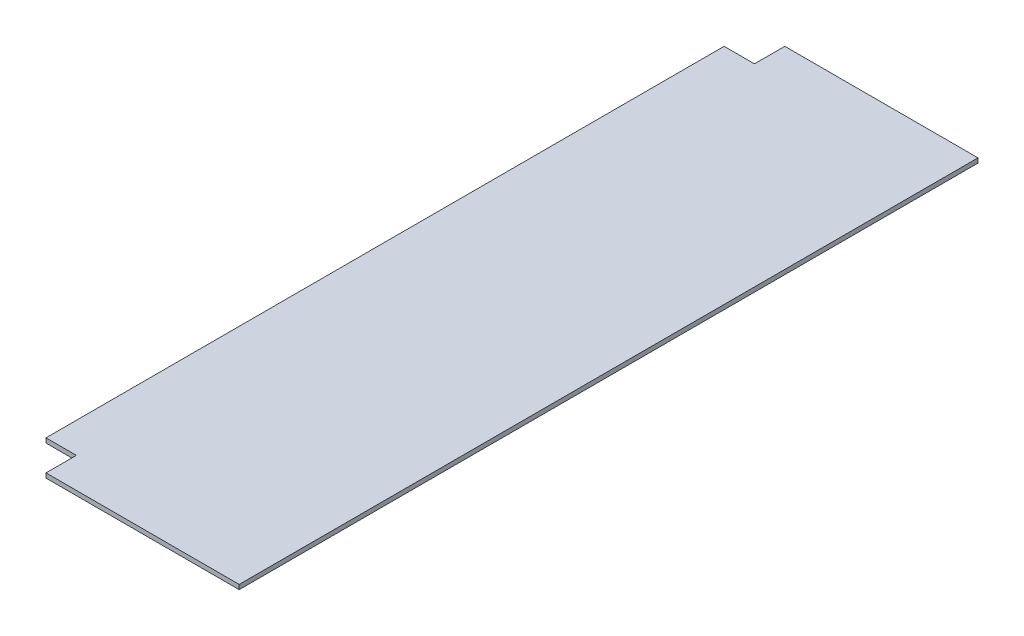
ISO-10303-21;
HEADER;
FILE_DESCRIPTION(('STEP AP214'),'2;1');
FILE_NAME('part.step','',(''),(''),'','','');
FILE_SCHEMA(('AUTOMOTIVE_DESIGN { 1 0 10303 214 1 1 1 1 }'));
ENDSEC;
DATA;
#1=APPLICATION_CONTEXT('core data for automotive mechanical design processes');
#2=APPLICATION_PROTOCOL_DEFINITION('international standard','automotive_design',2000,#1);
#3=PRODUCT_CONTEXT('',#1,'mechanical');
#4=PRODUCT('Part','Part','',(#3));
#5=PRODUCT_RELATED_PRODUCT_CATEGORY('part','',(#4));
#6=PRODUCT_DEFINITION_FORMATION('','',#4);
#7=PRODUCT_DEFINITION_CONTEXT('part definition',#1,'design');
#8=PRODUCT_DEFINITION('design','',#6,#7);
#9=PRODUCT_DEFINITION_SHAPE('','',#8);
#10=(LENGTH_UNIT() NAMED_UNIT(*) SI_UNIT(.MILLI.,.METRE.));
#11=(NAMED_UNIT(*) PLANE_ANGLE_UNIT() SI_UNIT($,.RADIAN.));
#12=(NAMED_UNIT(*) SI_UNIT($,.STERADIAN.) SOLID_ANGLE_UNIT());
#13=UNCERTAINTY_MEASURE_WITH_UNIT(LENGTH_MEASURE(1.E-05),#10,'distance_accuracy_value','');
#14=(GEOMETRIC_REPRESENTATION_CONTEXT(3) GLOBAL_UNCERTAINTY_ASSIGNED_CONTEXT((#13)) GLOBAL_UNIT_ASSIGNED_CONTEXT((#10,
#11,#12)) REPRESENTATION_CONTEXT('',''));
#15=CARTESIAN_POINT('',(0.,0.,0.));
#16=DIRECTION('',(0.,0.,1.));
#17=DIRECTION('',(1.,0.,0.));
#18=AXIS2_PLACEMENT_3D('',#15,#16,#17);
#19=CARTESIAN_POINT('',(123.917455195695,4.5,-365.));
#20=DIRECTION('',(-1.,0.,0.));
#21=DIRECTION('',(0.,0.,1.));
#22=AXIS2_PLACEMENT_3D('',#19,#20,#21);
#23=PLANE('',#22);
#24=DIRECTION('',(0.,0.,-1.));
#25=VECTOR('',#24,1.);
#26=CARTESIAN_POINT('',(123.917455195695,0.,-365.));
#27=LINE('',#26,#25);
#28=CARTESIAN_POINT('',(123.917455195696,0.,365.));
#29=VERTEX_POINT('',#28);
#30=CARTESIAN_POINT('',(123.917455195695,0.,-365.));
#31=VERTEX_POINT('',#30);
#32=EDGE_CURVE('E140',#29,#31,#27,.T.);
#33=ORIENTED_EDGE('',*,*,#32,.T.);
#34=DIRECTION('',(0.,-1.,0.));
#35=VECTOR('',#34,1.);
#36=CARTESIAN_POINT('',(123.917455195695,4.5,-365.));
#37=LINE('',#36,#35);
#38=CARTESIAN_POINT('',(123.917455195695,4.5,-365.));
#39=VERTEX_POINT('',#38);
#40=EDGE_CURVE('E11',#39,#31,#37,.T.);
#41=ORIENTED_EDGE('',*,*,#40,.F.);
#42=DIRECTION('',(0.,0.,-1.));
#43=VECTOR('',#42,1.);
#44=CARTESIAN_POINT('',(123.917455195695,4.5,-365.));
#45=LINE('',#44,#43);
#46=CARTESIAN_POINT('',(123.917455195696,4.5,365.));
#47=VERTEX_POINT('',#46);
#48=EDGE_CURVE('E162',#47,#39,#45,.T.);
#49=ORIENTED_EDGE('',*,*,#48,.F.);
#50=DIRECTION('',(0.,-1.,0.));
#51=VECTOR('',#50,1.);
#52=CARTESIAN_POINT('',(123.917455195696,4.5,365.));
#53=LINE('',#52,#51);
#54=EDGE_CURVE('E136',#47,#29,#53,.T.);
#55=ORIENTED_EDGE('',*,*,#54,.T.);
#56=EDGE_LOOP('',(#33,#41,#49,#55));
#57=FACE_BOUND('',#56,.T.);
#58=ADVANCED_FACE('F39',(#57),#23,.F.);
#59=CARTESIAN_POINT('',(-66.9625448043045,4.5,-365.));
#60=DIRECTION('',(0.,0.,1.));
#61=DIRECTION('',(1.,0.,0.));
#62=AXIS2_PLACEMENT_3D('',#59,#60,#61);
#63=PLANE('',#62);
#64=DIRECTION('',(-1.,0.,0.));
#65=VECTOR('',#64,1.);
#66=CARTESIAN_POINT('',(-66.9625448043045,0.,-365.));
#67=LINE('',#66,#65);
#68=CARTESIAN_POINT('',(-66.9625448043045,0.,-365.));
#69=VERTEX_POINT('',#68);
#70=EDGE_CURVE('E144',#31,#69,#67,.T.);
#71=ORIENTED_EDGE('',*,*,#70,.T.);
#72=DIRECTION('',(0.,-1.,0.));
#73=VECTOR('',#72,1.);
#74=CARTESIAN_POINT('',(-66.9625448043045,4.5,-365.));
#75=LINE('',#74,#73);
#76=CARTESIAN_POINT('',(-66.9625448043045,4.5,-365.));
#77=VERTEX_POINT('',#76);
#78=EDGE_CURVE('E48',#77,#69,#75,.T.);
#79=ORIENTED_EDGE('',*,*,#78,.F.);
#80=DIRECTION('',(-1.,0.,0.));
#81=VECTOR('',#80,1.);
#82=CARTESIAN_POINT('',(-66.9625448043045,4.5,-365.));
#83=LINE('',#82,#81);
#84=EDGE_CURVE('E99',#39,#77,#83,.T.);
#85=ORIENTED_EDGE('',*,*,#84,.F.);
#86=ORIENTED_EDGE('',*,*,#40,.T.);
#87=EDGE_LOOP('',(#71,#79,#85,#86));
#88=FACE_BOUND('',#87,.T.);
#89=ADVANCED_FACE('F208',(#88),#63,.F.);
#90=CARTESIAN_POINT('',(-66.9625448043045,4.5,-365.));
#91=DIRECTION('',(1.,0.,0.));
#92=DIRECTION('',(0.,0.,-1.));
#93=AXIS2_PLACEMENT_3D('',#90,#91,#92);
#94=PLANE('',#93);
#95=DIRECTION('',(0.,0.,1.));
#96=VECTOR('',#95,1.);
#97=CARTESIAN_POINT('',(-66.9625448043045,0.,-365.));
#98=LINE('',#97,#96);
#99=CARTESIAN_POINT('',(-66.9625448043045,0.,-335.));
#100=VERTEX_POINT('',#99);
#101=EDGE_CURVE('E147',#69,#100,#98,.T.);
#102=ORIENTED_EDGE('',*,*,#101,.T.);
#103=DIRECTION('',(0.,-1.,0.));
#104=VECTOR('',#103,1.);
#105=CARTESIAN_POINT('',(-66.9625448043045,4.5,-335.));
#106=LINE('',#105,#104);
#107=CARTESIAN_POINT('',(-66.9625448043045,4.5,-335.));
#108=VERTEX_POINT('',#107);
#109=EDGE_CURVE('E173',#108,#100,#106,.T.);
#110=ORIENTED_EDGE('',*,*,#109,.F.);
#111=DIRECTION('',(0.,0.,1.));
#112=VECTOR('',#111,1.);
#113=CARTESIAN_POINT('',(-66.9625448043045,4.5,-365.));
#114=LINE('',#113,#112);
#115=EDGE_CURVE('E183',#77,#108,#114,.T.);
#116=ORIENTED_EDGE('',*,*,#115,.F.);
#117=ORIENTED_EDGE('',*,*,#78,.T.);
#118=EDGE_LOOP('',(#102,#110,#116,#117));
#119=FACE_BOUND('',#118,.T.);
#120=ADVANCED_FACE('F181',(#119),#94,.F.);
#121=CARTESIAN_POINT('',(-96.9625448043045,4.5,-335.));
#122=DIRECTION('',(0.,0.,1.));
#123=DIRECTION('',(1.,0.,0.));
#124=AXIS2_PLACEMENT_3D('',#121,#122,#123);
#125=PLANE('',#124);
#126=DIRECTION('',(-1.,0.,0.));
#127=VECTOR('',#126,1.);
#128=CARTESIAN_POINT('',(-96.9625448043045,0.,-335.));
#129=LINE('',#128,#127);
#130=CARTESIAN_POINT('',(-96.9625448043045,0.,-335.));
#131=VERTEX_POINT('',#130);
#132=EDGE_CURVE('E150',#100,#131,#129,.T.);
#133=ORIENTED_EDGE('',*,*,#132,.T.);
#134=DIRECTION('',(0.,-1.,0.));
#135=VECTOR('',#134,1.);
#136=CARTESIAN_POINT('',(-96.9625448043045,4.5,-335.));
#137=LINE('',#136,#135);
#138=CARTESIAN_POINT('',(-96.9625448043045,4.5,-335.));
#139=VERTEX_POINT('',#138);
#140=EDGE_CURVE('E169',#139,#131,#137,.T.);
#141=ORIENTED_EDGE('',*,*,#140,.F.);
#142=DIRECTION('',(-1.,0.,0.));
#143=VECTOR('',#142,1.);
#144=CARTESIAN_POINT('',(-96.9625448043045,4.5,-335.));
#145=LINE('',#144,#143);
#146=EDGE_CURVE('E196',#108,#139,#145,.T.);
#147=ORIENTED_EDGE('',*,*,#146,.F.);
#148=ORIENTED_EDGE('',*,*,#109,.T.);
#149=EDGE_LOOP('',(#133,#141,#147,#148));
#150=FACE_BOUND('',#149,.T.);
#151=ADVANCED_FACE('F191',(#150),#125,.F.);
#152=CARTESIAN_POINT('',(-96.9625448043045,4.5,-335.));
#153=DIRECTION('',(1.,0.,0.));
#154=DIRECTION('',(0.,0.,-1.));
#155=AXIS2_PLACEMENT_3D('',#152,#153,#154);
#156=PLANE('',#155);
#157=DIRECTION('',(0.,0.,1.));
#158=VECTOR('',#157,1.);
#159=CARTESIAN_POINT('',(-96.9625448043045,0.,-335.));
#160=LINE('',#159,#158);
#161=CARTESIAN_POINT('',(-96.9625448043044,0.,335.));
#162=VERTEX_POINT('',#161);
#163=EDGE_CURVE('E153',#131,#162,#160,.T.);
#164=ORIENTED_EDGE('',*,*,#163,.T.);
#165=DIRECTION('',(0.,-1.,0.));
#166=VECTOR('',#165,1.);
#167=CARTESIAN_POINT('',(-96.9625448043044,4.5,335.));
#168=LINE('',#167,#166);
#169=CARTESIAN_POINT('',(-96.9625448043044,4.5,335.));
#170=VERTEX_POINT('',#169);
#171=EDGE_CURVE('E129',#170,#162,#168,.T.);
#172=ORIENTED_EDGE('',*,*,#171,.F.);
#173=DIRECTION('',(0.,0.,1.));
#174=VECTOR('',#173,1.);
#175=CARTESIAN_POINT('',(-96.9625448043045,4.5,-335.));
#176=LINE('',#175,#174);
#177=EDGE_CURVE('E118',#139,#170,#176,.T.);
#178=ORIENTED_EDGE('',*,*,#177,.F.);
#179=ORIENTED_EDGE('',*,*,#140,.T.);
#180=EDGE_LOOP('',(#164,#172,#178,#179));
#181=FACE_BOUND('',#180,.T.);
#182=ADVANCED_FACE('F194',(#181),#156,.F.);
#183=CARTESIAN_POINT('',(-96.9625448043044,4.5,335.));
#184=DIRECTION('',(0.,0.,-1.));
#185=DIRECTION('',(-1.,0.,0.));
#186=AXIS2_PLACEMENT_3D('',#183,#184,#185);
#187=PLANE('',#186);
#188=DIRECTION('',(1.,0.,0.));
#189=VECTOR('',#188,1.);
#190=CARTESIAN_POINT('',(-96.9625448043044,0.,335.));
#191=LINE('',#190,#189);
#192=CARTESIAN_POINT('',(-66.9625448043045,0.,335.));
#193=VERTEX_POINT('',#192);
#194=EDGE_CURVE('E127',#162,#193,#191,.T.);
#195=ORIENTED_EDGE('',*,*,#194,.T.);
#196=DIRECTION('',(0.,-1.,0.));
#197=VECTOR('',#196,1.);
#198=CARTESIAN_POINT('',(-66.9625448043045,4.5,335.));
#199=LINE('',#198,#197);
#200=CARTESIAN_POINT('',(-66.9625448043045,4.5,335.));
#201=VERTEX_POINT('',#200);
#202=EDGE_CURVE('E124',#201,#193,#199,.T.);
#203=ORIENTED_EDGE('',*,*,#202,.F.);
#204=DIRECTION('',(1.,0.,0.));
#205=VECTOR('',#204,1.);
#206=CARTESIAN_POINT('',(-96.9625448043044,4.5,335.));
#207=LINE('',#206,#205);
#208=EDGE_CURVE('E112',#170,#201,#207,.T.);
#209=ORIENTED_EDGE('',*,*,#208,.F.);
#210=ORIENTED_EDGE('',*,*,#171,.T.);
#211=EDGE_LOOP('',(#195,#203,#209,#210));
#212=FACE_BOUND('',#211,.T.);
#213=ADVANCED_FACE('F125',(#212),#187,.F.);
#214=CARTESIAN_POINT('',(-66.9625448043045,4.5,365.));
#215=DIRECTION('',(1.,0.,0.));
#216=DIRECTION('',(0.,0.,-1.));
#217=AXIS2_PLACEMENT_3D('',#214,#215,#216);
#218=PLANE('',#217);
#219=DIRECTION('',(0.,0.,1.));
#220=VECTOR('',#219,1.);
#221=CARTESIAN_POINT('',(-66.9625448043045,0.,365.));
#222=LINE('',#221,#220);
#223=CARTESIAN_POINT('',(-66.9625448043045,0.,365.));
#224=VERTEX_POINT('',#223);
#225=EDGE_CURVE('E85',#193,#224,#222,.T.);
#226=ORIENTED_EDGE('',*,*,#225,.T.);
#227=DIRECTION('',(0.,-1.,0.));
#228=VECTOR('',#227,1.);
#229=CARTESIAN_POINT('',(-66.9625448043045,4.5,365.));
#230=LINE('',#229,#228);
#231=CARTESIAN_POINT('',(-66.9625448043045,4.5,365.));
#232=VERTEX_POINT('',#231);
#233=EDGE_CURVE('E130',#232,#224,#230,.T.);
#234=ORIENTED_EDGE('',*,*,#233,.F.);
#235=DIRECTION('',(0.,0.,1.));
#236=VECTOR('',#235,1.);
#237=CARTESIAN_POINT('',(-66.9625448043045,4.5,365.));
#238=LINE('',#237,#236);
#239=EDGE_CURVE('E116',#201,#232,#238,.T.);
#240=ORIENTED_EDGE('',*,*,#239,.F.);
#241=ORIENTED_EDGE('',*,*,#202,.T.);
#242=EDGE_LOOP('',(#226,#234,#240,#241));
#243=FACE_BOUND('',#242,.T.);
#244=ADVANCED_FACE('F132',(#243),#218,.F.);
#245=CARTESIAN_POINT('',(-66.9625448043045,4.5,365.));
#246=DIRECTION('',(0.,0.,-1.));
#247=DIRECTION('',(-1.,0.,0.));
#248=AXIS2_PLACEMENT_3D('',#245,#246,#247);
#249=PLANE('',#248);
#250=DIRECTION('',(1.,0.,0.));
#251=VECTOR('',#250,1.);
#252=CARTESIAN_POINT('',(-66.9625448043045,0.,365.));
#253=LINE('',#252,#251);
#254=EDGE_CURVE('E91',#224,#29,#253,.T.);
#255=ORIENTED_EDGE('',*,*,#254,.T.);
#256=ORIENTED_EDGE('',*,*,#54,.F.);
#257=DIRECTION('',(1.,0.,0.));
#258=VECTOR('',#257,1.);
#259=CARTESIAN_POINT('',(-66.9625448043045,4.5,365.));
#260=LINE('',#259,#258);
#261=EDGE_CURVE('E56',#232,#47,#260,.T.);
#262=ORIENTED_EDGE('',*,*,#261,.F.);
#263=ORIENTED_EDGE('',*,*,#233,.T.);
#264=EDGE_LOOP('',(#255,#256,#262,#263));
#265=FACE_BOUND('',#264,.T.);
#266=ADVANCED_FACE('F224',(#265),#249,.F.);
#267=CARTESIAN_POINT('',(0.,4.5,0.));
#268=DIRECTION('',(0.,1.,0.));
#269=DIRECTION('',(0.,0.,1.));
#270=AXIS2_PLACEMENT_3D('',#267,#268,#269);
#271=PLANE('',#270);
#272=ORIENTED_EDGE('',*,*,#48,.T.);
#273=ORIENTED_EDGE('',*,*,#84,.T.);
#274=ORIENTED_EDGE('',*,*,#115,.T.);
#275=ORIENTED_EDGE('',*,*,#146,.T.);
#276=ORIENTED_EDGE('',*,*,#177,.T.);
#277=ORIENTED_EDGE('',*,*,#208,.T.);
#278=ORIENTED_EDGE('',*,*,#239,.T.);
#279=ORIENTED_EDGE('',*,*,#261,.T.);
#280=EDGE_LOOP('',(#272,#273,#274,#275,#276,#277,#278,#279));
#281=FACE_BOUND('',#280,.T.);
#282=ADVANCED_FACE('F114',(#281),#271,.T.);
#283=CARTESIAN_POINT('',(0.,0.,0.));
#284=DIRECTION('',(0.,1.,0.));
#285=DIRECTION('',(0.,0.,1.));
#286=AXIS2_PLACEMENT_3D('',#283,#284,#285);
#287=PLANE('',#286);
#288=ORIENTED_EDGE('',*,*,#32,.F.);
#289=ORIENTED_EDGE('',*,*,#254,.F.);
#290=ORIENTED_EDGE('',*,*,#225,.F.);
#291=ORIENTED_EDGE('',*,*,#194,.F.);
#292=ORIENTED_EDGE('',*,*,#163,.F.);
#293=ORIENTED_EDGE('',*,*,#132,.F.);
#294=ORIENTED_EDGE('',*,*,#101,.F.);
#295=ORIENTED_EDGE('',*,*,#70,.F.);
#296=EDGE_LOOP('',(#288,#289,#290,#291,#292,#293,#294,#295));
#297=FACE_BOUND('',#296,.T.);
#298=ADVANCED_FACE('F187',(#297),#287,.F.);
#299=CLOSED_SHELL('',(#58,#89,#120,#151,#182,#213,#244,#266,#282,#298));
#300=MANIFOLD_SOLID_BREP('B2',#299);
#301=ADVANCED_BREP_SHAPE_REPRESENTATION('',(#18,#300),#14);
#302=SHAPE_DEFINITION_REPRESENTATION(#9,#301);
ENDSEC;
END-ISO-10303-21;
